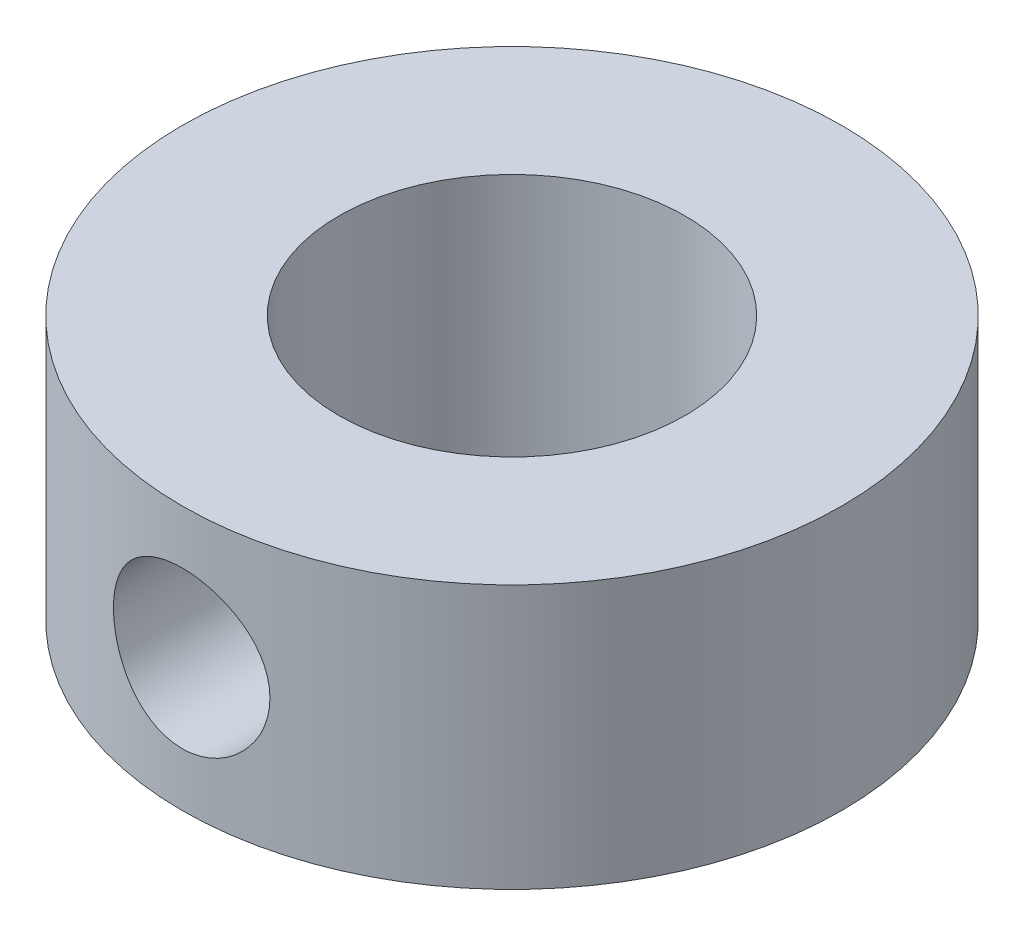
ISO-10303-21;
HEADER;
FILE_DESCRIPTION(('STEP AP214'),'2;1');
FILE_NAME('part.step','',(''),(''),'','','');
FILE_SCHEMA(('AUTOMOTIVE_DESIGN { 1 0 10303 214 1 1 1 1 }'));
ENDSEC;
DATA;
#1=APPLICATION_CONTEXT('core data for automotive mechanical design processes');
#2=APPLICATION_PROTOCOL_DEFINITION('international standard','automotive_design',2000,#1);
#3=PRODUCT_CONTEXT('',#1,'mechanical');
#4=PRODUCT('Part','Part','',(#3));
#5=PRODUCT_RELATED_PRODUCT_CATEGORY('part','',(#4));
#6=PRODUCT_DEFINITION_FORMATION('','',#4);
#7=PRODUCT_DEFINITION_CONTEXT('part definition',#1,'design');
#8=PRODUCT_DEFINITION('design','',#6,#7);
#9=PRODUCT_DEFINITION_SHAPE('','',#8);
#10=(LENGTH_UNIT() NAMED_UNIT(*) SI_UNIT(.MILLI.,.METRE.));
#11=(NAMED_UNIT(*) PLANE_ANGLE_UNIT() SI_UNIT($,.RADIAN.));
#12=(NAMED_UNIT(*) SI_UNIT($,.STERADIAN.) SOLID_ANGLE_UNIT());
#13=UNCERTAINTY_MEASURE_WITH_UNIT(LENGTH_MEASURE(1.E-05),#10,'distance_accuracy_value','');
#14=(GEOMETRIC_REPRESENTATION_CONTEXT(3) GLOBAL_UNCERTAINTY_ASSIGNED_CONTEXT((#13)) GLOBAL_UNIT_ASSIGNED_CONTEXT((#10,
#11,#12)) REPRESENTATION_CONTEXT('',''));
#15=CARTESIAN_POINT('',(0.,0.,0.));
#16=DIRECTION('',(0.,0.,1.));
#17=DIRECTION('',(1.,0.,0.));
#18=AXIS2_PLACEMENT_3D('',#15,#16,#17);
#19=CARTESIAN_POINT('',(0.,3.81,0.));
#20=DIRECTION('',(0.,1.,0.));
#21=DIRECTION('',(0.,0.,1.));
#22=AXIS2_PLACEMENT_3D('',#19,#20,#21);
#23=PLANE('',#22);
#24=CARTESIAN_POINT('',(0.,3.81,0.));
#25=DIRECTION('',(0.,1.,0.));
#26=DIRECTION('',(0.,0.,1.));
#27=AXIS2_PLACEMENT_3D('',#24,#25,#26);
#28=CIRCLE('',#27,4.7625);
#29=CARTESIAN_POINT('',(0.,3.81,4.7625));
#30=VERTEX_POINT('',#29);
#31=EDGE_CURVE('E43',#30,#30,#28,.T.);
#32=ORIENTED_EDGE('',*,*,#31,.T.);
#33=EDGE_LOOP('',(#32));
#34=FACE_BOUND('',#33,.T.);
#35=CARTESIAN_POINT('',(0.,3.81,0.));
#36=DIRECTION('',(0.,1.,0.));
#37=DIRECTION('',(0.,0.,1.));
#38=AXIS2_PLACEMENT_3D('',#35,#36,#37);
#39=CIRCLE('',#38,2.5);
#40=CARTESIAN_POINT('',(0.,3.81,2.5));
#41=VERTEX_POINT('',#40);
#42=EDGE_CURVE('E52',#41,#41,#39,.T.);
#43=ORIENTED_EDGE('',*,*,#42,.F.);
#44=EDGE_LOOP('',(#43));
#45=FACE_BOUND('',#44,.T.);
#46=ADVANCED_FACE('F32',(#34,#45),#23,.T.);
#47=CARTESIAN_POINT('',(0.,0.,0.));
#48=DIRECTION('',(0.,1.,0.));
#49=DIRECTION('',(0.,0.,1.));
#50=AXIS2_PLACEMENT_3D('',#47,#48,#49);
#51=PLANE('',#50);
#52=CARTESIAN_POINT('',(0.,0.,0.));
#53=DIRECTION('',(0.,1.,0.));
#54=DIRECTION('',(0.,0.,1.));
#55=AXIS2_PLACEMENT_3D('',#52,#53,#54);
#56=CIRCLE('',#55,4.7625);
#57=CARTESIAN_POINT('',(0.,0.,4.7625));
#58=VERTEX_POINT('',#57);
#59=EDGE_CURVE('E47',#58,#58,#56,.T.);
#60=ORIENTED_EDGE('',*,*,#59,.F.);
#61=EDGE_LOOP('',(#60));
#62=FACE_BOUND('',#61,.T.);
#63=CARTESIAN_POINT('',(0.,0.,0.));
#64=DIRECTION('',(0.,1.,0.));
#65=DIRECTION('',(0.,0.,1.));
#66=AXIS2_PLACEMENT_3D('',#63,#64,#65);
#67=CIRCLE('',#66,2.5);
#68=CARTESIAN_POINT('',(0.,0.,2.5));
#69=VERTEX_POINT('',#68);
#70=EDGE_CURVE('E54',#69,#69,#67,.T.);
#71=ORIENTED_EDGE('',*,*,#70,.T.);
#72=EDGE_LOOP('',(#71));
#73=FACE_BOUND('',#72,.T.);
#74=ADVANCED_FACE('F78',(#62,#73),#51,.F.);
#75=CARTESIAN_POINT('',(0.,3.81,0.));
#76=DIRECTION('',(0.,-1.,0.));
#77=DIRECTION('',(0.,0.,-1.));
#78=AXIS2_PLACEMENT_3D('',#75,#76,#77);
#79=CYLINDRICAL_SURFACE('',#78,4.7625);
#80=CARTESIAN_POINT('',(0.,0.774700000000008,4.7625));
#81=CARTESIAN_POINT('',(-0.0625504471650139,0.774701927608512,4.76249888658254));
#82=CARTESIAN_POINT('',(-0.125123129283414,0.779909781707139,4.76125531619252));
#83=CARTESIAN_POINT('',(-0.248481844038288,0.800576439643067,4.75641479439014));
#84=CARTESIAN_POINT('',(-0.309266728250472,0.81604168852836,4.75281636336277));
#85=CARTESIAN_POINT('',(-0.427250047842575,0.856704137521542,4.74366551356278));
#86=CARTESIAN_POINT('',(-0.484452471724356,0.881890282741236,4.73811531503235));
#87=CARTESIAN_POINT('',(-0.593819309373723,0.941242251593707,4.72565533763748));
#88=CARTESIAN_POINT('',(-0.645983676957435,0.975408157533289,4.71874554631142));
#89=CARTESIAN_POINT('',(-0.744769781920514,1.05242511212147,4.70417494660862));
#90=CARTESIAN_POINT('',(-0.791283867055914,1.0954122351177,4.69650348465821));
#91=CARTESIAN_POINT('',(-0.876514301242979,1.18855970815086,4.68134670992166));
#92=CARTESIAN_POINT('',(-0.915229851617912,1.23872079200094,4.67386141627044));
#93=CARTESIAN_POINT('',(-0.984257303274572,1.3456113977317,4.65981813018725));
#94=CARTESIAN_POINT('',(-1.01445122919643,1.40241905054017,4.6532737183417));
#95=CARTESIAN_POINT('',(-1.06482048280172,1.52048371233283,4.64200756588757));
#96=CARTESIAN_POINT('',(-1.08499723988878,1.58174008507448,4.63728556525076));
#97=CARTESIAN_POINT('',(-1.1143969583754,1.70578609663537,4.63030798184956));
#98=CARTESIAN_POINT('',(-1.12381226659384,1.76852766049331,4.62800914824604));
#99=CARTESIAN_POINT('',(-1.1320205269598,1.89473867644944,4.62600854277725));
#100=CARTESIAN_POINT('',(-1.1308150272652,1.9582080211146,4.62630639240253));
#101=CARTESIAN_POINT('',(-1.11796991019263,2.08261764875476,4.62942650333921));
#102=CARTESIAN_POINT('',(-1.10655703472154,2.14358293054619,4.63219390421103));
#103=CARTESIAN_POINT('',(-1.07398179717215,2.26270790680083,4.63985416565765));
#104=CARTESIAN_POINT('',(-1.05281880205468,2.3208674188249,4.64474716423846));
#105=CARTESIAN_POINT('',(-1.00114461591173,2.4333502308673,4.65615920388045));
#106=CARTESIAN_POINT('',(-0.970549092235659,2.48763324911748,4.66269281104616));
#107=CARTESIAN_POINT('',(-0.900937448372102,2.59037719592243,4.6766413798207));
#108=CARTESIAN_POINT('',(-0.861919990000866,2.6388371973354,4.68405648140832));
#109=CARTESIAN_POINT('',(-0.775386694919819,2.72986151096834,4.69916539760802));
#110=CARTESIAN_POINT('',(-0.727678881710187,2.77224314962247,4.70686148789115));
#111=CARTESIAN_POINT('',(-0.625742654598686,2.84843697261253,4.72149336042034));
#112=CARTESIAN_POINT('',(-0.571514078356698,2.88224894353392,4.72842912372918));
#113=CARTESIAN_POINT('',(-0.457830918707979,2.94040136504325,4.7407880498009));
#114=CARTESIAN_POINT('',(-0.398361889110949,2.96471456182001,4.7462068476709));
#115=CARTESIAN_POINT('',(-0.276024255491213,3.00294984409206,4.75488931700387));
#116=CARTESIAN_POINT('',(-0.213156237830649,3.0168737157628,4.75815335891022));
#117=CARTESIAN_POINT('',(-0.0873691590361518,3.03366172083008,4.76210460266796));
#118=CARTESIAN_POINT('',(-0.0244851159606699,3.03677493092157,4.76284982691246));
#119=CARTESIAN_POINT('',(0.100904914262536,3.03253301057845,4.76184360723796));
#120=CARTESIAN_POINT('',(0.16341093147156,3.02517872382943,4.76009236453545));
#121=CARTESIAN_POINT('',(0.285421966304748,3.00041646531752,4.75432693440289));
#122=CARTESIAN_POINT('',(0.344955665814232,2.98314217860543,4.75034285425274));
#123=CARTESIAN_POINT('',(0.460278770394102,2.93918115434735,4.74055923690497));
#124=CARTESIAN_POINT('',(0.516067819691336,2.91249352395726,4.73475952750301));
#125=CARTESIAN_POINT('',(0.623325436186186,2.84996553746852,4.72184709836335));
#126=CARTESIAN_POINT('',(0.674708549514258,2.81398280285455,4.71471447952687));
#127=CARTESIAN_POINT('',(0.770796159921666,2.73407027324923,4.69996242077331));
#128=CARTESIAN_POINT('',(0.815499622590926,2.69013924971063,4.69234290571582));
#129=CARTESIAN_POINT('',(0.897968165505122,2.5944258874936,4.6772704338935));
#130=CARTESIAN_POINT('',(0.935559392964989,2.5424923671793,4.66982480514445));
#131=CARTESIAN_POINT('',(1.00149022808019,2.43290504386739,4.65613164810588));
#132=CARTESIAN_POINT('',(1.0298302497261,2.37525149699102,4.64988406620905));
#133=CARTESIAN_POINT('',(1.0762491323619,2.25617540302121,4.63935996173661));
#134=CARTESIAN_POINT('',(1.09438832132569,2.19477744713415,4.63507187952516));
#135=CARTESIAN_POINT('',(1.12005827002545,2.06968779325943,4.62893650286401));
#136=CARTESIAN_POINT('',(1.12759108086312,2.00599654120204,4.62708873650105));
#137=CARTESIAN_POINT('',(1.13173541942954,1.87989021963666,4.62607660378741));
#138=CARTESIAN_POINT('',(1.12862381464115,1.8174846415471,4.62684420801562));
#139=CARTESIAN_POINT('',(1.11219513075476,1.69411493291204,4.63082047949845));
#140=CARTESIAN_POINT('',(1.09887821898312,1.63315077874982,4.63402910673));
#141=CARTESIAN_POINT('',(1.06256106322214,1.51466143110805,4.64248992098927));
#142=CARTESIAN_POINT('',(1.03960787796392,1.45712105619124,4.64773216751233));
#143=CARTESIAN_POINT('',(0.984707919621938,1.34666926787406,4.65967190423071));
#144=CARTESIAN_POINT('',(0.95276002488178,1.29375843286492,4.66636957589639));
#145=CARTESIAN_POINT('',(0.879888490013,1.19271827914991,4.68066337542781));
#146=CARTESIAN_POINT('',(0.83877051437427,1.14473156757363,4.68827700003745));
#147=CARTESIAN_POINT('',(0.749111183772152,1.05624883249811,4.7034351287937));
#148=CARTESIAN_POINT('',(0.700568092234966,1.01575456622778,4.71097961633199));
#149=CARTESIAN_POINT('',(0.596506539598588,0.94278364311163,4.72529205111388));
#150=CARTESIAN_POINT('',(0.540889568123418,0.91044448812679,4.73204576758136));
#151=CARTESIAN_POINT('',(0.424856108392295,0.855626047206833,4.74386898028089));
#152=CARTESIAN_POINT('',(0.364443352132297,0.833139181533446,4.74893977052069));
#153=CARTESIAN_POINT('',(0.253386137402228,0.802286460019709,4.75601012346783));
#154=CARTESIAN_POINT('',(0.203302998812327,0.791962762929223,4.75842781496556));
#155=CARTESIAN_POINT('',(0.102151476578724,0.778168954446352,4.76167315947544));
#156=CARTESIAN_POINT('',(0.051083153112265,0.774698425777523,4.76250090929605));
#157=CARTESIAN_POINT('',(0.,0.774700000000008,4.7625));
#158=B_SPLINE_CURVE_WITH_KNOTS('',3,(#80,#81,#82,#83,#84,#85,#86,#87,#88,#89,#90,#91,#92,#93,
#94,#95,#96,#97,#98,#99,#100,#101,#102,#103,#104,#105,#106,#107,#108,#109,#110,#111,#112,#113,
#114,#115,#116,#117,#118,#119,#120,#121,#122,#123,#124,#125,#126,#127,#128,#129,#130,#131,#132,
#133,#134,#135,#136,#137,#138,#139,#140,#141,#142,#143,#144,#145,#146,#147,#148,#149,#150,#151,
#152,#153,#154,#155,#156,#157),.UNSPECIFIED.,.T.,.F.,(4,2,2,2,2,2,2,2,2,2,2,2,2,2,2,2,2,2,2,2,2,
2,2,2,2,2,2,2,2,2,2,2,2,2,2,2,2,2,4),(0.,0.187464233445307,0.375046368371232,0.562415804978716,
0.749786959039261,0.940301149532551,1.13083484137834,1.323889669599,1.51691694186556,
1.7064373300301,1.8959300929301,2.08131531006456,2.26671256527164,2.45381796865748,
2.64095312363525,2.83287860741466,3.02480887033708,3.21728584337237,3.40972971734638,
3.59770916783964,3.78567346795126,3.97116223372721,4.15666859761832,4.34520498082454,
4.53377053056521,4.72647545534146,4.91917175540807,5.1107161261548,5.30222345023355,
5.48878783947732,5.67534916987397,5.86100983556767,6.04669366374171,6.23676713117165,
6.42688512083306,6.62002158350616,6.81300919697148,6.9661151731601,7.11921182672833),.UNSPECIFIED.);
#159=CARTESIAN_POINT('',(0.,0.774700000000008,4.7625));
#160=VERTEX_POINT('',#159);
#161=EDGE_CURVE('E10',#160,#160,#158,.T.);
#162=ORIENTED_EDGE('',*,*,#161,.T.);
#163=EDGE_LOOP('',(#162));
#164=FACE_BOUND('',#163,.T.);
#165=ORIENTED_EDGE('',*,*,#31,.F.);
#166=EDGE_LOOP('',(#165));
#167=FACE_BOUND('',#166,.T.);
#168=ORIENTED_EDGE('',*,*,#59,.T.);
#169=EDGE_LOOP('',(#168));
#170=FACE_BOUND('',#169,.T.);
#171=ADVANCED_FACE('F34',(#164,#167,#170),#79,.T.);
#172=CARTESIAN_POINT('',(0.,3.81,0.));
#173=DIRECTION('',(0.,-1.,0.));
#174=DIRECTION('',(0.,0.,-1.));
#175=AXIS2_PLACEMENT_3D('',#172,#173,#174);
#176=CYLINDRICAL_SURFACE('',#175,2.5);
#177=CARTESIAN_POINT('',(-1.13029999999999,1.905,2.22989280235621));
#178=CARTESIAN_POINT('',(-1.13029234929594,1.96473933081761,2.2299007044576));
#179=CARTESIAN_POINT('',(-1.12553422392124,2.02455179656599,2.23232876390113));
#180=CARTESIAN_POINT('',(-1.10670357865686,2.14241715101616,2.24172022452344));
#181=CARTESIAN_POINT('',(-1.09260795334402,2.2004653003516,2.24869487545092));
#182=CARTESIAN_POINT('',(-1.05579462202122,2.31286876707023,2.26621004198794));
#183=CARTESIAN_POINT('',(-1.03311631565871,2.36723964073343,2.27673423938463));
#184=CARTESIAN_POINT('',(-0.979898604957642,2.47139211489929,2.30013924991816));
#185=CARTESIAN_POINT('',(-0.949360100398427,2.52117423980384,2.31301979326856));
#186=CARTESIAN_POINT('',(-0.878889310208545,2.61842398428599,2.34074317099516));
#187=CARTESIAN_POINT('',(-0.838465750380127,2.66551478803288,2.35565961214202));
#188=CARTESIAN_POINT('',(-0.750399919782074,2.75253317256978,2.38517426826696));
#189=CARTESIAN_POINT('',(-0.702754578588034,2.79245769068462,2.39977234485443));
#190=CARTESIAN_POINT('',(-0.598521570909952,2.86605607751903,2.42792768411306));
#191=CARTESIAN_POINT('',(-0.541595057039622,2.89928989032784,2.44138961082327));
#192=CARTESIAN_POINT('',(-0.422238523020822,2.95554193558482,2.46483346193536));
#193=CARTESIAN_POINT('',(-0.359811378925302,2.97856546901934,2.47481719157354));
#194=CARTESIAN_POINT('',(-0.23519711486667,3.01232728486308,2.48965457663097));
#195=CARTESIAN_POINT('',(-0.173220289219581,3.0237197425143,2.49478007232496));
#196=CARTESIAN_POINT('',(-0.048037673181197,3.03602630505145,2.50032202080841));
#197=CARTESIAN_POINT('',(0.0151675085449162,3.03694547333247,2.5007407491207));
#198=CARTESIAN_POINT('',(0.136191965432282,3.02858600470407,2.49696966207191));
#199=CARTESIAN_POINT('',(0.194073482406106,3.02003106624254,2.49310688002468));
#200=CARTESIAN_POINT('',(0.307475332676293,2.99422870661721,2.48167440024843));
#201=CARTESIAN_POINT('',(0.362995490607743,2.9769806410816,2.47410442772776));
#202=CARTESIAN_POINT('',(0.471126308301566,2.93410336638027,2.4558287967587));
#203=CARTESIAN_POINT('',(0.523680083656282,2.90835103496019,2.44507733066937));
#204=CARTESIAN_POINT('',(0.623857804165862,2.84933198809204,2.42145704186425));
#205=CARTESIAN_POINT('',(0.671479935847252,2.81606252263718,2.40858744473785));
#206=CARTESIAN_POINT('',(0.764540074807131,2.73984144999279,2.38076123648055));
#207=CARTESIAN_POINT('',(0.809490408994936,2.69632460460801,2.36572001538316));
#208=CARTESIAN_POINT('',(0.891688913063652,2.60240011030139,2.33598062599436));
#209=CARTESIAN_POINT('',(0.928932987288615,2.55198882069829,2.32128264378689));
#210=CARTESIAN_POINT('',(0.996243369941155,2.4429229261286,2.2932269448459));
#211=CARTESIAN_POINT('',(1.02591818387882,2.38400191964467,2.27995755455504));
#212=CARTESIAN_POINT('',(1.07471863545173,2.26124494671047,2.2573681938273));
#213=CARTESIAN_POINT('',(1.09385334056315,2.1974132588901,2.24804483029552));
#214=CARTESIAN_POINT('',(1.11967183318976,2.07154409278202,2.23529177499219));
#215=CARTESIAN_POINT('',(1.127154663465,2.00970968874935,2.23148523986685));
#216=CARTESIAN_POINT('',(1.13183640331124,1.88556471658037,2.22911554450785));
#217=CARTESIAN_POINT('',(1.12904007215575,1.82325438213344,2.23054995770216));
#218=CARTESIAN_POINT('',(1.11397472012758,1.70528271324808,2.23810603257553));
#219=CARTESIAN_POINT('',(1.1024932672064,1.64949230132076,2.24383765768202));
#220=CARTESIAN_POINT('',(1.07147739637993,1.54069811923433,2.25881173527385));
#221=CARTESIAN_POINT('',(1.05194085610168,1.48769508765379,2.26805511299339));
#222=CARTESIAN_POINT('',(1.00440518662358,1.38328420542436,2.28951463273302));
#223=CARTESIAN_POINT('',(0.976063128341239,1.33205706298873,2.30184636569555));
#224=CARTESIAN_POINT('',(0.912042833268314,1.23481452822674,2.32795448064102));
#225=CARTESIAN_POINT('',(0.876361080020135,1.18880165051062,2.34173155353223));
#226=CARTESIAN_POINT('',(0.794525806287322,1.09854209099254,2.37082116660643));
#227=CARTESIAN_POINT('',(0.747685362813571,1.05492102700391,2.386150711737));
#228=CARTESIAN_POINT('',(0.647030051008896,0.976011443541721,2.41538747037271));
#229=CARTESIAN_POINT('',(0.593214044358077,0.940724286710024,2.42929445106993));
#230=CARTESIAN_POINT('',(0.479224360504093,0.879253446910983,2.45433904671274));
#231=CARTESIAN_POINT('',(0.418989758558253,0.853169433751902,2.46544599007741));
#232=CARTESIAN_POINT('',(0.294347130634978,0.811728505046161,2.48340746295194));
#233=CARTESIAN_POINT('',(0.229942112984965,0.796363949182474,2.49026502083015));
#234=CARTESIAN_POINT('',(0.104325034799939,0.77787998548924,2.4985516776334));
#235=CARTESIAN_POINT('',(0.0432671443963489,0.77388287067106,2.50036958420837));
#236=CARTESIAN_POINT('',(-0.0786534424007484,0.775794105721383,2.49950519537235));
#237=CARTESIAN_POINT('',(-0.139516181448645,0.781700118760733,2.49682396161797));
#238=CARTESIAN_POINT('',(-0.256337382193509,0.802626917009847,2.48748214117378));
#239=CARTESIAN_POINT('',(-0.312391858621918,0.817205783670293,2.48101471602673));
#240=CARTESIAN_POINT('',(-0.421210397417246,0.854537896198438,2.46487526768668));
#241=CARTESIAN_POINT('',(-0.473973895180995,0.877292540207287,2.45520269640307));
#242=CARTESIAN_POINT('',(-0.577391206233121,0.931470167334299,2.43301141217474));
#243=CARTESIAN_POINT('',(-0.627837902890198,0.963242253138129,2.42038268797138));
#244=CARTESIAN_POINT('',(-0.72290570545711,1.03407904745639,2.39371034274846));
#245=CARTESIAN_POINT('',(-0.767524268960078,1.07314692067659,2.37966610894243));
#246=CARTESIAN_POINT('',(-0.853485314204803,1.16120605136608,2.35027476587979));
#247=CARTESIAN_POINT('',(-0.894261859572337,1.21074742838865,2.33491499828606));
#248=CARTESIAN_POINT('',(-0.967057139128329,1.31636366597117,2.30571982807476));
#249=CARTESIAN_POINT('',(-0.999070178000374,1.3724427417259,2.29188542024439));
#250=CARTESIAN_POINT('',(-1.05347192987063,1.49025400092658,2.26739862316462));
#251=CARTESIAN_POINT('',(-1.07579242917077,1.55202265738388,2.25676894289651));
#252=CARTESIAN_POINT('',(-1.10940295027945,1.67898366295493,2.24044364463881));
#253=CARTESIAN_POINT('',(-1.12072999552486,1.74416373593428,2.23473147300272));
#254=CARTESIAN_POINT('',(-1.12896484313097,1.8414865172758,2.23056874712107));
#255=CARTESIAN_POINT('',(-1.13030406835054,1.87323291844149,2.22988860032221));
#256=CARTESIAN_POINT('',(-1.13029999999999,1.905,2.22989280235621));
#257=B_SPLINE_CURVE_WITH_KNOTS('',3,(#177,#178,#179,#180,#181,#182,#183,#184,#185,#186,#187,
#188,#189,#190,#191,#192,#193,#194,#195,#196,#197,#198,#199,#200,#201,#202,#203,#204,#205,#206,
#207,#208,#209,#210,#211,#212,#213,#214,#215,#216,#217,#218,#219,#220,#221,#222,#223,#224,#225,
#226,#227,#228,#229,#230,#231,#232,#233,#234,#235,#236,#237,#238,#239,#240,#241,#242,#243,#244,
#245,#246,#247,#248,#249,#250,#251,#252,#253,#254,#255,#256),.UNSPECIFIED.,.T.,.F.,(4,2,2,2,2,2,
2,2,2,2,2,2,2,2,2,2,2,2,2,2,2,2,2,2,2,2,2,2,2,2,2,2,2,2,2,2,2,2,2,4),(0.,0.179114962904029,
0.358674805464406,0.537420167292906,0.716145076722535,0.906810147400693,1.09755651012113,
1.29835091478502,1.49904094834764,1.68769074112309,1.87624932578284,2.05133993788453,
2.22644353036163,2.40420232088145,2.58202624681602,2.77422353037453,2.96652270037496,
3.16734858398393,3.36800142960117,3.55417060543378,3.74025359540275,3.91122761938896,
4.08224672082162,4.26100441669468,4.43984795592956,4.63639358852512,4.83297133525054,
5.03161700039801,5.23012093536083,5.41281695801689,5.59546987617907,5.76952908101354,
5.94361806592203,6.12567566799356,6.30781242570204,6.50483762351208,6.70199056370037,
6.90050937618222,7.09835727862553,7.19360373614433),.UNSPECIFIED.);
#258=CARTESIAN_POINT('',(-1.13029999999999,1.905,2.22989280235621));
#259=VERTEX_POINT('',#258);
#260=EDGE_CURVE('E57',#259,#259,#257,.T.);
#261=ORIENTED_EDGE('',*,*,#260,.F.);
#262=EDGE_LOOP('',(#261));
#263=FACE_BOUND('',#262,.T.);
#264=ORIENTED_EDGE('',*,*,#42,.T.);
#265=EDGE_LOOP('',(#264));
#266=FACE_BOUND('',#265,.T.);
#267=ORIENTED_EDGE('',*,*,#70,.F.);
#268=EDGE_LOOP('',(#267));
#269=FACE_BOUND('',#268,.T.);
#270=ADVANCED_FACE('F64',(#263,#266,#269),#176,.F.);
#271=CARTESIAN_POINT('',(0.,1.905,0.));
#272=DIRECTION('',(0.,0.,-1.));
#273=DIRECTION('',(-1.,0.,0.));
#274=AXIS2_PLACEMENT_3D('',#271,#272,#273);
#275=CYLINDRICAL_SURFACE('',#274,1.13029999999999);
#276=ORIENTED_EDGE('',*,*,#260,.T.);
#277=EDGE_LOOP('',(#276));
#278=FACE_BOUND('',#277,.T.);
#279=ORIENTED_EDGE('',*,*,#161,.F.);
#280=EDGE_LOOP('',(#279));
#281=FACE_BOUND('',#280,.T.);
#282=ADVANCED_FACE('F67',(#278,#281),#275,.F.);
#283=CLOSED_SHELL('',(#46,#74,#171,#270,#282));
#284=MANIFOLD_SOLID_BREP('B2',#283);
#285=ADVANCED_BREP_SHAPE_REPRESENTATION('',(#18,#284),#14);
#286=SHAPE_DEFINITION_REPRESENTATION(#9,#285);
ENDSEC;
END-ISO-10303-21;
